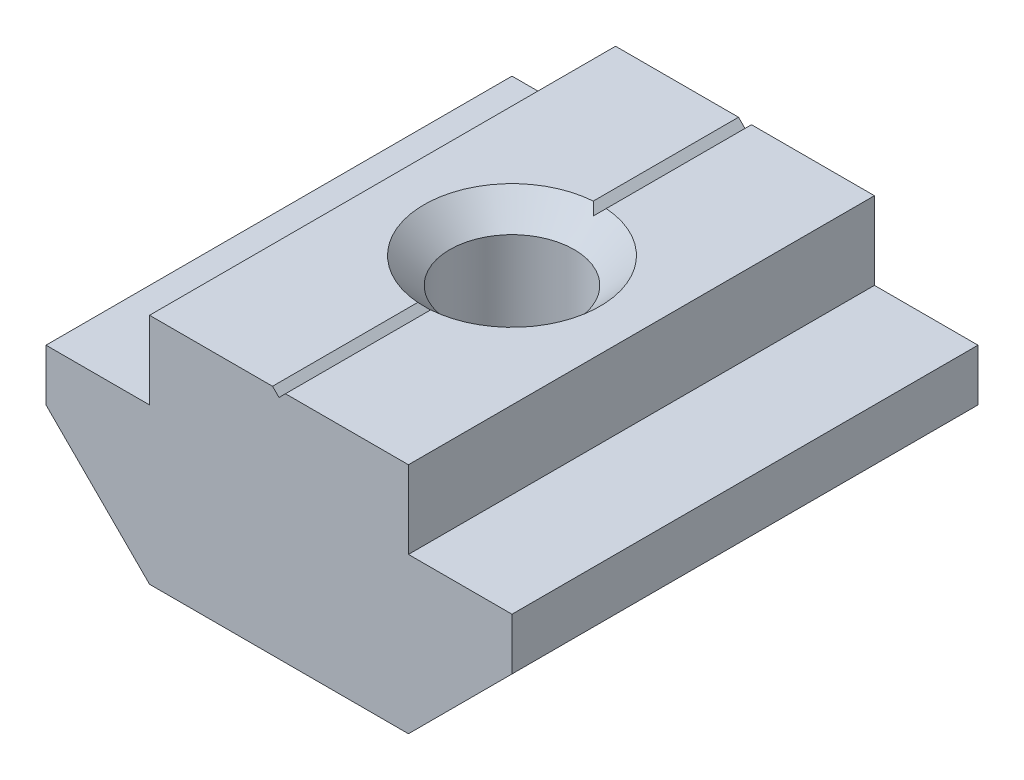
ISO-10303-21;
HEADER;
FILE_DESCRIPTION(('STEP AP214'),'2;1');
FILE_NAME('part.step','',(''),(''),'','','');
FILE_SCHEMA(('AUTOMOTIVE_DESIGN { 1 0 10303 214 1 1 1 1 }'));
ENDSEC;
DATA;
#1=APPLICATION_CONTEXT('core data for automotive mechanical design processes');
#2=APPLICATION_PROTOCOL_DEFINITION('international standard','automotive_design',2000,#1);
#3=PRODUCT_CONTEXT('',#1,'mechanical');
#4=PRODUCT('Part','Part','',(#3));
#5=PRODUCT_RELATED_PRODUCT_CATEGORY('part','',(#4));
#6=PRODUCT_DEFINITION_FORMATION('','',#4);
#7=PRODUCT_DEFINITION_CONTEXT('part definition',#1,'design');
#8=PRODUCT_DEFINITION('design','',#6,#7);
#9=PRODUCT_DEFINITION_SHAPE('','',#8);
#10=(LENGTH_UNIT() NAMED_UNIT(*) SI_UNIT(.MILLI.,.METRE.));
#11=(NAMED_UNIT(*) PLANE_ANGLE_UNIT() SI_UNIT($,.RADIAN.));
#12=(NAMED_UNIT(*) SI_UNIT($,.STERADIAN.) SOLID_ANGLE_UNIT());
#13=UNCERTAINTY_MEASURE_WITH_UNIT(LENGTH_MEASURE(1.E-05),#10,'distance_accuracy_value','');
#14=(GEOMETRIC_REPRESENTATION_CONTEXT(3) GLOBAL_UNCERTAINTY_ASSIGNED_CONTEXT((#13)) GLOBAL_UNIT_ASSIGNED_CONTEXT((#10,
#11,#12)) REPRESENTATION_CONTEXT('',''));
#15=CARTESIAN_POINT('',(0.,0.,0.));
#16=DIRECTION('',(0.,0.,1.));
#17=DIRECTION('',(1.,0.,0.));
#18=AXIS2_PLACEMENT_3D('',#15,#16,#17);
#19=CARTESIAN_POINT('',(0.25,9.,18.));
#20=DIRECTION('',(0.707106781186543,-0.707106781186552,0.));
#21=DIRECTION('',(0.707106781186552,0.707106781186543,0.));
#22=AXIS2_PLACEMENT_3D('',#19,#20,#21);
#23=PLANE('',#22);
#24=DIRECTION('',(0.,0.,-1.));
#25=VECTOR('',#24,1.);
#26=CARTESIAN_POINT('',(0.25,9.,18.));
#27=LINE('',#26,#25);
#28=CARTESIAN_POINT('',(0.25,9.,18.));
#29=VERTEX_POINT('',#28);
#30=CARTESIAN_POINT('',(0.250000000000002,9.,12.3907963666372));
#31=VERTEX_POINT('',#30);
#32=EDGE_CURVE('E259',#29,#31,#27,.T.);
#33=ORIENTED_EDGE('',*,*,#32,.T.);
#34=CARTESIAN_POINT('',(0.2502,9.0002,12.3909821586083));
#35=CARTESIAN_POINT('',(0.207979234163481,8.95797923416348,12.3517976118688));
#36=CARTESIAN_POINT('',(0.166002242608615,8.91600224260861,12.3121068827314));
#37=CARTESIAN_POINT('',(0.0825355731981371,8.83253557319814,12.2317128334428));
#38=CARTESIAN_POINT('',(0.0410458980863347,8.79104589808634,12.1910095075942));
#39=CARTESIAN_POINT('',(-0.000200000000007266,8.7498,12.1497999936504));
#40=B_SPLINE_CURVE_WITH_KNOTS('',3,(#34,#35,#36,#37,#38,#39),.UNSPECIFIED.,.F.,.F.,(4,2,4),(0.,
0.21423213245231,0.428465470549166),.UNSPECIFIED.);
#41=CARTESIAN_POINT('',(0.,8.75,12.15));
#42=VERTEX_POINT('',#41);
#43=EDGE_CURVE('E200',#31,#42,#40,.T.);
#44=ORIENTED_EDGE('',*,*,#43,.T.);
#45=DIRECTION('',(0.,0.,-1.));
#46=VECTOR('',#45,1.);
#47=CARTESIAN_POINT('',(0.,8.75,18.));
#48=LINE('',#47,#46);
#49=CARTESIAN_POINT('',(0.,8.75,18.));
#50=VERTEX_POINT('',#49);
#51=EDGE_CURVE('E254',#50,#42,#48,.T.);
#52=ORIENTED_EDGE('',*,*,#51,.F.);
#53=DIRECTION('',(-0.707106781186552,-0.707106781186543,0.));
#54=VECTOR('',#53,1.);
#55=CARTESIAN_POINT('',(0.25,9.,18.));
#56=LINE('',#55,#54);
#57=EDGE_CURVE('E314',#29,#50,#56,.T.);
#58=ORIENTED_EDGE('',*,*,#57,.F.);
#59=EDGE_LOOP('',(#33,#44,#52,#58));
#60=FACE_BOUND('',#59,.T.);
#61=ADVANCED_FACE('F51',(#60),#23,.F.);
#62=CARTESIAN_POINT('',(-0.25,9.,18.));
#63=DIRECTION('',(-0.707106781186543,-0.707106781186552,0.));
#64=DIRECTION('',(0.707106781186552,-0.707106781186543,0.));
#65=AXIS2_PLACEMENT_3D('',#62,#63,#64);
#66=PLANE('',#65);
#67=ORIENTED_EDGE('',*,*,#51,.T.);
#68=CARTESIAN_POINT('',(0.000200000000000102,8.7498,12.1497999936504));
#69=CARTESIAN_POINT('',(-0.041045898086342,8.79104589808634,12.1910095075942));
#70=CARTESIAN_POINT('',(-0.0825355731981417,8.83253557319814,12.2317128334428));
#71=CARTESIAN_POINT('',(-0.166002242608608,8.91600224260861,12.3121068827315));
#72=CARTESIAN_POINT('',(-0.207979234163467,8.95797923416347,12.3517976118689));
#73=CARTESIAN_POINT('',(-0.250199999999975,9.00019999999997,12.3909821586084));
#74=B_SPLINE_CURVE_WITH_KNOTS('',3,(#68,#69,#70,#71,#72,#73),.UNSPECIFIED.,.F.,.F.,(4,2,4),(0.,
0.214233338096856,0.428465470549166),.UNSPECIFIED.);
#75=CARTESIAN_POINT('',(-0.25,9.,12.3907963666372));
#76=VERTEX_POINT('',#75);
#77=EDGE_CURVE('E377',#42,#76,#74,.T.);
#78=ORIENTED_EDGE('',*,*,#77,.T.);
#79=DIRECTION('',(0.,0.,-1.));
#80=VECTOR('',#79,1.);
#81=CARTESIAN_POINT('',(-0.25,9.,18.));
#82=LINE('',#81,#80);
#83=CARTESIAN_POINT('',(-0.25,9.,18.));
#84=VERTEX_POINT('',#83);
#85=EDGE_CURVE('E249',#84,#76,#82,.T.);
#86=ORIENTED_EDGE('',*,*,#85,.F.);
#87=DIRECTION('',(-0.707106781186552,0.707106781186543,0.));
#88=VECTOR('',#87,1.);
#89=CARTESIAN_POINT('',(-0.25,9.,18.));
#90=LINE('',#89,#88);
#91=EDGE_CURVE('E317',#50,#84,#90,.T.);
#92=ORIENTED_EDGE('',*,*,#91,.F.);
#93=EDGE_LOOP('',(#67,#78,#86,#92));
#94=FACE_BOUND('',#93,.T.);
#95=ADVANCED_FACE('F474',(#94),#66,.F.);
#96=CARTESIAN_POINT('',(-4.99999999999996,0.,18.));
#97=DIRECTION('',(0.,1.,0.));
#98=DIRECTION('',(-1.,0.,0.));
#99=AXIS2_PLACEMENT_3D('',#96,#97,#98);
#100=PLANE('',#99);
#101=CARTESIAN_POINT('',(0.,0.,9.));
#102=DIRECTION('',(0.,-1.,0.));
#103=DIRECTION('',(0.,0.,-1.));
#104=AXIS2_PLACEMENT_3D('',#101,#102,#103);
#105=CIRCLE('',#104,3.40000000000001);
#106=CARTESIAN_POINT('',(0.,0.,5.59999999999999));
#107=VERTEX_POINT('',#106);
#108=EDGE_CURVE('E411',#107,#107,#105,.T.);
#109=ORIENTED_EDGE('',*,*,#108,.F.);
#110=EDGE_LOOP('',(#109));
#111=FACE_BOUND('',#110,.T.);
#112=DIRECTION('',(1.,0.,0.));
#113=VECTOR('',#112,1.);
#114=CARTESIAN_POINT('',(-4.99999999999996,0.,0.));
#115=LINE('',#114,#113);
#116=CARTESIAN_POINT('',(-4.99999999999996,0.,0.));
#117=VERTEX_POINT('',#116);
#118=CARTESIAN_POINT('',(4.99999999999996,0.,0.));
#119=VERTEX_POINT('',#118);
#120=EDGE_CURVE('E195',#117,#119,#115,.T.);
#121=ORIENTED_EDGE('',*,*,#120,.T.);
#122=DIRECTION('',(0.,0.,-1.));
#123=VECTOR('',#122,1.);
#124=CARTESIAN_POINT('',(4.99999999999996,0.,18.));
#125=LINE('',#124,#123);
#126=CARTESIAN_POINT('',(4.99999999999996,0.,18.));
#127=VERTEX_POINT('',#126);
#128=EDGE_CURVE('E60',#127,#119,#125,.T.);
#129=ORIENTED_EDGE('',*,*,#128,.F.);
#130=DIRECTION('',(1.,0.,0.));
#131=VECTOR('',#130,1.);
#132=CARTESIAN_POINT('',(-4.99999999999996,0.,18.));
#133=LINE('',#132,#131);
#134=CARTESIAN_POINT('',(-4.99999999999996,0.,18.));
#135=VERTEX_POINT('',#134);
#136=EDGE_CURVE('E237',#135,#127,#133,.T.);
#137=ORIENTED_EDGE('',*,*,#136,.F.);
#138=DIRECTION('',(0.,0.,-1.));
#139=VECTOR('',#138,1.);
#140=CARTESIAN_POINT('',(-4.99999999999996,0.,18.));
#141=LINE('',#140,#139);
#142=EDGE_CURVE('E191',#135,#117,#141,.T.);
#143=ORIENTED_EDGE('',*,*,#142,.T.);
#144=EDGE_LOOP('',(#121,#129,#137,#143));
#145=FACE_BOUND('',#144,.T.);
#146=ADVANCED_FACE('F53',(#111,#145),#100,.F.);
#147=CARTESIAN_POINT('',(4.99999999999996,0.,18.));
#148=DIRECTION('',(-0.707106781186544,0.707106781186551,0.));
#149=DIRECTION('',(-0.707106781186551,-0.707106781186544,0.));
#150=AXIS2_PLACEMENT_3D('',#147,#148,#149);
#151=PLANE('',#150);
#152=DIRECTION('',(0.707106781186551,0.707106781186544,0.));
#153=VECTOR('',#152,1.);
#154=CARTESIAN_POINT('',(4.99999999999996,0.,0.));
#155=LINE('',#154,#153);
#156=CARTESIAN_POINT('',(9.,4.,0.));
#157=VERTEX_POINT('',#156);
#158=EDGE_CURVE('E199',#119,#157,#155,.T.);
#159=ORIENTED_EDGE('',*,*,#158,.T.);
#160=DIRECTION('',(0.,0.,-1.));
#161=VECTOR('',#160,1.);
#162=CARTESIAN_POINT('',(9.,4.,18.));
#163=LINE('',#162,#161);
#164=CARTESIAN_POINT('',(9.,4.,18.));
#165=VERTEX_POINT('',#164);
#166=EDGE_CURVE('E275',#165,#157,#163,.T.);
#167=ORIENTED_EDGE('',*,*,#166,.F.);
#168=DIRECTION('',(0.707106781186551,0.707106781186544,0.));
#169=VECTOR('',#168,1.);
#170=CARTESIAN_POINT('',(4.99999999999996,0.,18.));
#171=LINE('',#170,#169);
#172=EDGE_CURVE('E132',#127,#165,#171,.T.);
#173=ORIENTED_EDGE('',*,*,#172,.F.);
#174=ORIENTED_EDGE('',*,*,#128,.T.);
#175=EDGE_LOOP('',(#159,#167,#173,#174));
#176=FACE_BOUND('',#175,.T.);
#177=ADVANCED_FACE('F281',(#176),#151,.F.);
#178=CARTESIAN_POINT('',(9.,4.,18.));
#179=DIRECTION('',(-1.,0.,0.));
#180=DIRECTION('',(0.,0.,1.));
#181=AXIS2_PLACEMENT_3D('',#178,#179,#180);
#182=PLANE('',#181);
#183=DIRECTION('',(0.,1.,0.));
#184=VECTOR('',#183,1.);
#185=CARTESIAN_POINT('',(9.,4.,0.));
#186=LINE('',#185,#184);
#187=CARTESIAN_POINT('',(9.,6.,0.));
#188=VERTEX_POINT('',#187);
#189=EDGE_CURVE('E203',#157,#188,#186,.T.);
#190=ORIENTED_EDGE('',*,*,#189,.T.);
#191=DIRECTION('',(0.,0.,-1.));
#192=VECTOR('',#191,1.);
#193=CARTESIAN_POINT('',(9.,6.,18.));
#194=LINE('',#193,#192);
#195=CARTESIAN_POINT('',(9.,6.,18.));
#196=VERTEX_POINT('',#195);
#197=EDGE_CURVE('E271',#196,#188,#194,.T.);
#198=ORIENTED_EDGE('',*,*,#197,.F.);
#199=DIRECTION('',(0.,1.,0.));
#200=VECTOR('',#199,1.);
#201=CARTESIAN_POINT('',(9.,4.,18.));
#202=LINE('',#201,#200);
#203=EDGE_CURVE('E302',#165,#196,#202,.T.);
#204=ORIENTED_EDGE('',*,*,#203,.F.);
#205=ORIENTED_EDGE('',*,*,#166,.T.);
#206=EDGE_LOOP('',(#190,#198,#204,#205));
#207=FACE_BOUND('',#206,.T.);
#208=ADVANCED_FACE('F292',(#207),#182,.F.);
#209=CARTESIAN_POINT('',(9.,6.,18.));
#210=DIRECTION('',(0.,-1.,0.));
#211=DIRECTION('',(0.,0.,-1.));
#212=AXIS2_PLACEMENT_3D('',#209,#210,#211);
#213=PLANE('',#212);
#214=DIRECTION('',(-1.,0.,0.));
#215=VECTOR('',#214,1.);
#216=CARTESIAN_POINT('',(9.,6.,0.));
#217=LINE('',#216,#215);
#218=CARTESIAN_POINT('',(5.,6.,0.));
#219=VERTEX_POINT('',#218);
#220=EDGE_CURVE('E206',#188,#219,#217,.T.);
#221=ORIENTED_EDGE('',*,*,#220,.T.);
#222=DIRECTION('',(0.,0.,-1.));
#223=VECTOR('',#222,1.);
#224=CARTESIAN_POINT('',(5.,6.,18.));
#225=LINE('',#224,#223);
#226=CARTESIAN_POINT('',(5.,6.,18.));
#227=VERTEX_POINT('',#226);
#228=EDGE_CURVE('E267',#227,#219,#225,.T.);
#229=ORIENTED_EDGE('',*,*,#228,.F.);
#230=DIRECTION('',(-1.,0.,0.));
#231=VECTOR('',#230,1.);
#232=CARTESIAN_POINT('',(9.,6.,18.));
#233=LINE('',#232,#231);
#234=EDGE_CURVE('E298',#196,#227,#233,.T.);
#235=ORIENTED_EDGE('',*,*,#234,.F.);
#236=ORIENTED_EDGE('',*,*,#197,.T.);
#237=EDGE_LOOP('',(#221,#229,#235,#236));
#238=FACE_BOUND('',#237,.T.);
#239=ADVANCED_FACE('F296',(#238),#213,.F.);
#240=CARTESIAN_POINT('',(5.,6.,18.));
#241=DIRECTION('',(-1.,0.,0.));
#242=DIRECTION('',(0.,0.,1.));
#243=AXIS2_PLACEMENT_3D('',#240,#241,#242);
#244=PLANE('',#243);
#245=DIRECTION('',(0.,1.,0.));
#246=VECTOR('',#245,1.);
#247=CARTESIAN_POINT('',(5.,6.,0.));
#248=LINE('',#247,#246);
#249=CARTESIAN_POINT('',(5.,9.,0.));
#250=VERTEX_POINT('',#249);
#251=EDGE_CURVE('E209',#219,#250,#248,.T.);
#252=ORIENTED_EDGE('',*,*,#251,.T.);
#253=DIRECTION('',(0.,0.,-1.));
#254=VECTOR('',#253,1.);
#255=CARTESIAN_POINT('',(5.,9.,18.));
#256=LINE('',#255,#254);
#257=CARTESIAN_POINT('',(5.,9.,18.));
#258=VERTEX_POINT('',#257);
#259=EDGE_CURVE('E263',#258,#250,#256,.T.);
#260=ORIENTED_EDGE('',*,*,#259,.F.);
#261=DIRECTION('',(0.,1.,0.));
#262=VECTOR('',#261,1.);
#263=CARTESIAN_POINT('',(5.,6.,18.));
#264=LINE('',#263,#262);
#265=EDGE_CURVE('E301',#227,#258,#264,.T.);
#266=ORIENTED_EDGE('',*,*,#265,.F.);
#267=ORIENTED_EDGE('',*,*,#228,.T.);
#268=EDGE_LOOP('',(#252,#260,#266,#267));
#269=FACE_BOUND('',#268,.T.);
#270=ADVANCED_FACE('F462',(#269),#244,.F.);
#271=CARTESIAN_POINT('',(5.,9.,18.));
#272=DIRECTION('',(0.,-1.,0.));
#273=DIRECTION('',(0.,0.,-1.));
#274=AXIS2_PLACEMENT_3D('',#271,#272,#273);
#275=PLANE('',#274);
#276=CARTESIAN_POINT('',(0.250000000000001,9.,5.6092036333628));
#277=VERTEX_POINT('',#276);
#278=CARTESIAN_POINT('',(0.25,9.,0.));
#279=VERTEX_POINT('',#278);
#280=EDGE_CURVE('E258',#277,#279,#27,.T.);
#281=ORIENTED_EDGE('',*,*,#280,.F.);
#282=CARTESIAN_POINT('',(0.,9.,9.));
#283=DIRECTION('',(0.,-1.,0.));
#284=DIRECTION('',(0.,0.,-1.));
#285=AXIS2_PLACEMENT_3D('',#282,#283,#284);
#286=CIRCLE('',#285,3.4);
#287=EDGE_CURVE('E393',#277,#31,#286,.T.);
#288=ORIENTED_EDGE('',*,*,#287,.T.);
#289=ORIENTED_EDGE('',*,*,#32,.F.);
#290=DIRECTION('',(-1.,0.,0.));
#291=VECTOR('',#290,1.);
#292=CARTESIAN_POINT('',(5.,9.,18.));
#293=LINE('',#292,#291);
#294=EDGE_CURVE('E307',#258,#29,#293,.T.);
#295=ORIENTED_EDGE('',*,*,#294,.F.);
#296=ORIENTED_EDGE('',*,*,#259,.T.);
#297=DIRECTION('',(-1.,0.,0.));
#298=VECTOR('',#297,1.);
#299=CARTESIAN_POINT('',(5.,9.,0.));
#300=LINE('',#299,#298);
#301=EDGE_CURVE('E212',#250,#279,#300,.T.);
#302=ORIENTED_EDGE('',*,*,#301,.T.);
#303=EDGE_LOOP('',(#281,#288,#289,#295,#296,#302));
#304=FACE_BOUND('',#303,.T.);
#305=ADVANCED_FACE('F457',(#304),#275,.F.);
#306=CARTESIAN_POINT('',(0.,8.75,5.84999999999999));
#307=VERTEX_POINT('',#306);
#308=CARTESIAN_POINT('',(0.,8.75,0.));
#309=VERTEX_POINT('',#308);
#310=EDGE_CURVE('E253',#307,#309,#48,.T.);
#311=ORIENTED_EDGE('',*,*,#310,.F.);
#312=CARTESIAN_POINT('',(-0.000200000000000256,8.7498,5.8502000063496));
#313=CARTESIAN_POINT('',(0.0410458980863417,8.79104589808634,5.80899049240578));
#314=CARTESIAN_POINT('',(0.0825355731981412,8.83253557319814,5.76828716655719));
#315=CARTESIAN_POINT('',(0.166002242608608,8.91600224260861,5.68789311726854));
#316=CARTESIAN_POINT('',(0.207979234163467,8.95797923416347,5.64820238813115));
#317=CARTESIAN_POINT('',(0.250199999999975,9.00019999999997,5.60901784139162));
#318=B_SPLINE_CURVE_WITH_KNOTS('',3,(#312,#313,#314,#315,#316,#317),.UNSPECIFIED.,.F.,.F.,(4,2,
4),(0.,0.214233338096855,0.428465470549165),.UNSPECIFIED.);
#319=EDGE_CURVE('E383',#307,#277,#318,.T.);
#320=ORIENTED_EDGE('',*,*,#319,.T.);
#321=ORIENTED_EDGE('',*,*,#280,.T.);
#322=DIRECTION('',(-0.707106781186552,-0.707106781186543,0.));
#323=VECTOR('',#322,1.);
#324=CARTESIAN_POINT('',(0.25,9.,0.));
#325=LINE('',#324,#323);
#326=EDGE_CURVE('E216',#279,#309,#325,.T.);
#327=ORIENTED_EDGE('',*,*,#326,.T.);
#328=EDGE_LOOP('',(#311,#320,#321,#327));
#329=FACE_BOUND('',#328,.T.);
#330=ADVANCED_FACE('F453',(#329),#23,.F.);
#331=CARTESIAN_POINT('',(-0.25,9.,5.60920363336281));
#332=VERTEX_POINT('',#331);
#333=CARTESIAN_POINT('',(-0.25,9.,0.));
#334=VERTEX_POINT('',#333);
#335=EDGE_CURVE('E248',#332,#334,#82,.T.);
#336=ORIENTED_EDGE('',*,*,#335,.F.);
#337=CARTESIAN_POINT('',(-0.2502,9.0002,5.60901784139167));
#338=CARTESIAN_POINT('',(-0.207979234163481,8.95797923416348,5.64820238813117));
#339=CARTESIAN_POINT('',(-0.166002242608615,8.91600224260861,5.68789311726855));
#340=CARTESIAN_POINT('',(-0.082535573198137,8.83253557319814,5.76828716655718));
#341=CARTESIAN_POINT('',(-0.0410458980863346,8.79104589808634,5.80899049240577));
#342=CARTESIAN_POINT('',(0.000200000000007443,8.7498,5.85020000634959));
#343=B_SPLINE_CURVE_WITH_KNOTS('',3,(#337,#338,#339,#340,#341,#342),.UNSPECIFIED.,.F.,.F.,(4,2,
4),(0.,0.21423213245231,0.428465470549166),.UNSPECIFIED.);
#344=EDGE_CURVE('E67',#332,#307,#343,.T.);
#345=ORIENTED_EDGE('',*,*,#344,.T.);
#346=ORIENTED_EDGE('',*,*,#310,.T.);
#347=DIRECTION('',(-0.707106781186552,0.707106781186543,0.));
#348=VECTOR('',#347,1.);
#349=CARTESIAN_POINT('',(-0.25,9.,0.));
#350=LINE('',#349,#348);
#351=EDGE_CURVE('E220',#309,#334,#350,.T.);
#352=ORIENTED_EDGE('',*,*,#351,.T.);
#353=EDGE_LOOP('',(#336,#345,#346,#352));
#354=FACE_BOUND('',#353,.T.);
#355=ADVANCED_FACE('F430',(#354),#66,.F.);
#356=CARTESIAN_POINT('',(-5.,9.,18.));
#357=DIRECTION('',(0.,-1.,0.));
#358=DIRECTION('',(0.,0.,-1.));
#359=AXIS2_PLACEMENT_3D('',#356,#357,#358);
#360=PLANE('',#359);
#361=ORIENTED_EDGE('',*,*,#85,.T.);
#362=CARTESIAN_POINT('',(0.,9.,9.));
#363=DIRECTION('',(0.,-1.,0.));
#364=DIRECTION('',(0.,0.,-1.));
#365=AXIS2_PLACEMENT_3D('',#362,#363,#364);
#366=CIRCLE('',#365,3.4);
#367=EDGE_CURVE('E11',#76,#332,#366,.T.);
#368=ORIENTED_EDGE('',*,*,#367,.T.);
#369=ORIENTED_EDGE('',*,*,#335,.T.);
#370=DIRECTION('',(-1.,0.,0.));
#371=VECTOR('',#370,1.);
#372=CARTESIAN_POINT('',(-5.,9.,0.));
#373=LINE('',#372,#371);
#374=CARTESIAN_POINT('',(-5.,9.,0.));
#375=VERTEX_POINT('',#374);
#376=EDGE_CURVE('E224',#334,#375,#373,.T.);
#377=ORIENTED_EDGE('',*,*,#376,.T.);
#378=DIRECTION('',(0.,0.,-1.));
#379=VECTOR('',#378,1.);
#380=CARTESIAN_POINT('',(-5.,9.,18.));
#381=LINE('',#380,#379);
#382=CARTESIAN_POINT('',(-5.,9.,18.));
#383=VERTEX_POINT('',#382);
#384=EDGE_CURVE('E244',#383,#375,#381,.T.);
#385=ORIENTED_EDGE('',*,*,#384,.F.);
#386=DIRECTION('',(-1.,0.,0.));
#387=VECTOR('',#386,1.);
#388=CARTESIAN_POINT('',(-5.,9.,18.));
#389=LINE('',#388,#387);
#390=EDGE_CURVE('E320',#84,#383,#389,.T.);
#391=ORIENTED_EDGE('',*,*,#390,.F.);
#392=EDGE_LOOP('',(#361,#368,#369,#377,#385,#391));
#393=FACE_BOUND('',#392,.T.);
#394=ADVANCED_FACE('F526',(#393),#360,.F.);
#395=CARTESIAN_POINT('',(-5.,6.,18.));
#396=DIRECTION('',(1.,0.,0.));
#397=DIRECTION('',(0.,0.,-1.));
#398=AXIS2_PLACEMENT_3D('',#395,#396,#397);
#399=PLANE('',#398);
#400=DIRECTION('',(0.,-1.,0.));
#401=VECTOR('',#400,1.);
#402=CARTESIAN_POINT('',(-5.,6.,0.));
#403=LINE('',#402,#401);
#404=CARTESIAN_POINT('',(-5.,6.,0.));
#405=VERTEX_POINT('',#404);
#406=EDGE_CURVE('E227',#375,#405,#403,.T.);
#407=ORIENTED_EDGE('',*,*,#406,.T.);
#408=DIRECTION('',(0.,0.,-1.));
#409=VECTOR('',#408,1.);
#410=CARTESIAN_POINT('',(-5.,6.,18.));
#411=LINE('',#410,#409);
#412=CARTESIAN_POINT('',(-5.,6.,18.));
#413=VERTEX_POINT('',#412);
#414=EDGE_CURVE('E183',#413,#405,#411,.T.);
#415=ORIENTED_EDGE('',*,*,#414,.F.);
#416=DIRECTION('',(0.,-1.,0.));
#417=VECTOR('',#416,1.);
#418=CARTESIAN_POINT('',(-5.,6.,18.));
#419=LINE('',#418,#417);
#420=EDGE_CURVE('E169',#383,#413,#419,.T.);
#421=ORIENTED_EDGE('',*,*,#420,.F.);
#422=ORIENTED_EDGE('',*,*,#384,.T.);
#423=EDGE_LOOP('',(#407,#415,#421,#422));
#424=FACE_BOUND('',#423,.T.);
#425=ADVANCED_FACE('F531',(#424),#399,.F.);
#426=CARTESIAN_POINT('',(-9.,6.,18.));
#427=DIRECTION('',(0.,-1.,0.));
#428=DIRECTION('',(0.,0.,-1.));
#429=AXIS2_PLACEMENT_3D('',#426,#427,#428);
#430=PLANE('',#429);
#431=DIRECTION('',(-1.,0.,0.));
#432=VECTOR('',#431,1.);
#433=CARTESIAN_POINT('',(-9.,6.,0.));
#434=LINE('',#433,#432);
#435=CARTESIAN_POINT('',(-9.,6.,0.));
#436=VERTEX_POINT('',#435);
#437=EDGE_CURVE('E179',#405,#436,#434,.T.);
#438=ORIENTED_EDGE('',*,*,#437,.T.);
#439=DIRECTION('',(0.,0.,-1.));
#440=VECTOR('',#439,1.);
#441=CARTESIAN_POINT('',(-9.,6.,18.));
#442=LINE('',#441,#440);
#443=CARTESIAN_POINT('',(-9.,6.,18.));
#444=VERTEX_POINT('',#443);
#445=EDGE_CURVE('E176',#444,#436,#442,.T.);
#446=ORIENTED_EDGE('',*,*,#445,.F.);
#447=DIRECTION('',(-1.,0.,0.));
#448=VECTOR('',#447,1.);
#449=CARTESIAN_POINT('',(-9.,6.,18.));
#450=LINE('',#449,#448);
#451=EDGE_CURVE('E162',#413,#444,#450,.T.);
#452=ORIENTED_EDGE('',*,*,#451,.F.);
#453=ORIENTED_EDGE('',*,*,#414,.T.);
#454=EDGE_LOOP('',(#438,#446,#452,#453));
#455=FACE_BOUND('',#454,.T.);
#456=ADVANCED_FACE('F177',(#455),#430,.F.);
#457=CARTESIAN_POINT('',(-9.,4.,18.));
#458=DIRECTION('',(1.,0.,0.));
#459=DIRECTION('',(0.,0.,-1.));
#460=AXIS2_PLACEMENT_3D('',#457,#458,#459);
#461=PLANE('',#460);
#462=DIRECTION('',(0.,-1.,0.));
#463=VECTOR('',#462,1.);
#464=CARTESIAN_POINT('',(-9.,4.,0.));
#465=LINE('',#464,#463);
#466=CARTESIAN_POINT('',(-9.,4.,0.));
#467=VERTEX_POINT('',#466);
#468=EDGE_CURVE('E232',#436,#467,#465,.T.);
#469=ORIENTED_EDGE('',*,*,#468,.T.);
#470=DIRECTION('',(0.,0.,-1.));
#471=VECTOR('',#470,1.);
#472=CARTESIAN_POINT('',(-9.,4.,18.));
#473=LINE('',#472,#471);
#474=CARTESIAN_POINT('',(-9.,4.,18.));
#475=VERTEX_POINT('',#474);
#476=EDGE_CURVE('E184',#475,#467,#473,.T.);
#477=ORIENTED_EDGE('',*,*,#476,.F.);
#478=DIRECTION('',(0.,-1.,0.));
#479=VECTOR('',#478,1.);
#480=CARTESIAN_POINT('',(-9.,4.,18.));
#481=LINE('',#480,#479);
#482=EDGE_CURVE('E166',#444,#475,#481,.T.);
#483=ORIENTED_EDGE('',*,*,#482,.F.);
#484=ORIENTED_EDGE('',*,*,#445,.T.);
#485=EDGE_LOOP('',(#469,#477,#483,#484));
#486=FACE_BOUND('',#485,.T.);
#487=ADVANCED_FACE('F186',(#486),#461,.F.);
#488=CARTESIAN_POINT('',(-4.99999999999996,0.,18.));
#489=DIRECTION('',(0.707106781186544,0.707106781186551,0.));
#490=DIRECTION('',(-0.707106781186551,0.707106781186544,0.));
#491=AXIS2_PLACEMENT_3D('',#488,#489,#490);
#492=PLANE('',#491);
#493=DIRECTION('',(0.707106781186551,-0.707106781186544,0.));
#494=VECTOR('',#493,1.);
#495=CARTESIAN_POINT('',(-4.99999999999996,0.,0.));
#496=LINE('',#495,#494);
#497=EDGE_CURVE('E123',#467,#117,#496,.T.);
#498=ORIENTED_EDGE('',*,*,#497,.T.);
#499=ORIENTED_EDGE('',*,*,#142,.F.);
#500=DIRECTION('',(0.707106781186551,-0.707106781186544,0.));
#501=VECTOR('',#500,1.);
#502=CARTESIAN_POINT('',(-4.99999999999996,0.,18.));
#503=LINE('',#502,#501);
#504=EDGE_CURVE('E75',#475,#135,#503,.T.);
#505=ORIENTED_EDGE('',*,*,#504,.F.);
#506=ORIENTED_EDGE('',*,*,#476,.T.);
#507=EDGE_LOOP('',(#498,#499,#505,#506));
#508=FACE_BOUND('',#507,.T.);
#509=ADVANCED_FACE('F548',(#508),#492,.F.);
#510=CARTESIAN_POINT('',(0.,0.,18.));
#511=DIRECTION('',(0.,0.,1.));
#512=DIRECTION('',(1.,0.,0.));
#513=AXIS2_PLACEMENT_3D('',#510,#511,#512);
#514=PLANE('',#513);
#515=ORIENTED_EDGE('',*,*,#136,.T.);
#516=ORIENTED_EDGE('',*,*,#172,.T.);
#517=ORIENTED_EDGE('',*,*,#203,.T.);
#518=ORIENTED_EDGE('',*,*,#234,.T.);
#519=ORIENTED_EDGE('',*,*,#265,.T.);
#520=ORIENTED_EDGE('',*,*,#294,.T.);
#521=ORIENTED_EDGE('',*,*,#57,.T.);
#522=ORIENTED_EDGE('',*,*,#91,.T.);
#523=ORIENTED_EDGE('',*,*,#390,.T.);
#524=ORIENTED_EDGE('',*,*,#420,.T.);
#525=ORIENTED_EDGE('',*,*,#451,.T.);
#526=ORIENTED_EDGE('',*,*,#482,.T.);
#527=ORIENTED_EDGE('',*,*,#504,.T.);
#528=EDGE_LOOP('',(#515,#516,#517,#518,#519,#520,#521,#522,#523,#524,#525,#526,#527));
#529=FACE_BOUND('',#528,.T.);
#530=ADVANCED_FACE('F164',(#529),#514,.T.);
#531=CARTESIAN_POINT('',(0.,0.,0.));
#532=DIRECTION('',(0.,0.,1.));
#533=DIRECTION('',(1.,0.,0.));
#534=AXIS2_PLACEMENT_3D('',#531,#532,#533);
#535=PLANE('',#534);
#536=ORIENTED_EDGE('',*,*,#120,.F.);
#537=ORIENTED_EDGE('',*,*,#497,.F.);
#538=ORIENTED_EDGE('',*,*,#468,.F.);
#539=ORIENTED_EDGE('',*,*,#437,.F.);
#540=ORIENTED_EDGE('',*,*,#406,.F.);
#541=ORIENTED_EDGE('',*,*,#376,.F.);
#542=ORIENTED_EDGE('',*,*,#351,.F.);
#543=ORIENTED_EDGE('',*,*,#326,.F.);
#544=ORIENTED_EDGE('',*,*,#301,.F.);
#545=ORIENTED_EDGE('',*,*,#251,.F.);
#546=ORIENTED_EDGE('',*,*,#220,.F.);
#547=ORIENTED_EDGE('',*,*,#189,.F.);
#548=ORIENTED_EDGE('',*,*,#158,.F.);
#549=EDGE_LOOP('',(#536,#537,#538,#539,#540,#541,#542,#543,#544,#545,#546,#547,#548));
#550=FACE_BOUND('',#549,.T.);
#551=ADVANCED_FACE('F286',(#550),#535,.F.);
#552=CARTESIAN_POINT('',(0.,7.99999999999999,9.));
#553=DIRECTION('',(0.,1.,0.));
#554=DIRECTION('',(0.,0.,1.));
#555=AXIS2_PLACEMENT_3D('',#552,#553,#554);
#556=CONICAL_SURFACE('',#555,2.4,0.785398163397443);
#557=CARTESIAN_POINT('',(0.,7.99999999999999,9.));
#558=DIRECTION('',(0.,-1.,0.));
#559=DIRECTION('',(0.,0.,-1.));
#560=AXIS2_PLACEMENT_3D('',#557,#558,#559);
#561=CIRCLE('',#560,2.4);
#562=CARTESIAN_POINT('',(0.,7.99999999999999,6.6));
#563=VERTEX_POINT('',#562);
#564=EDGE_CURVE('E399',#563,#563,#561,.T.);
#565=ORIENTED_EDGE('',*,*,#564,.T.);
#566=EDGE_LOOP('',(#565));
#567=FACE_BOUND('',#566,.T.);
#568=ORIENTED_EDGE('',*,*,#287,.F.);
#569=ORIENTED_EDGE('',*,*,#319,.F.);
#570=ORIENTED_EDGE('',*,*,#344,.F.);
#571=ORIENTED_EDGE('',*,*,#367,.F.);
#572=ORIENTED_EDGE('',*,*,#77,.F.);
#573=ORIENTED_EDGE('',*,*,#43,.F.);
#574=EDGE_LOOP('',(#568,#569,#570,#571,#572,#573));
#575=FACE_BOUND('',#574,.T.);
#576=ADVANCED_FACE('F433',(#567,#575),#556,.F.);
#577=CARTESIAN_POINT('',(0.,0.,9.));
#578=DIRECTION('',(0.,-1.,0.));
#579=DIRECTION('',(0.,0.,-1.));
#580=AXIS2_PLACEMENT_3D('',#577,#578,#579);
#581=CYLINDRICAL_SURFACE('',#580,2.4);
#582=ORIENTED_EDGE('',*,*,#564,.F.);
#583=EDGE_LOOP('',(#582));
#584=FACE_BOUND('',#583,.T.);
#585=CARTESIAN_POINT('',(0.,1.,9.));
#586=DIRECTION('',(0.,-1.,0.));
#587=DIRECTION('',(0.,0.,-1.));
#588=AXIS2_PLACEMENT_3D('',#585,#586,#587);
#589=CIRCLE('',#588,2.4);
#590=CARTESIAN_POINT('',(0.,1.,6.6));
#591=VERTEX_POINT('',#590);
#592=EDGE_CURVE('E405',#591,#591,#589,.T.);
#593=ORIENTED_EDGE('',*,*,#592,.T.);
#594=EDGE_LOOP('',(#593));
#595=FACE_BOUND('',#594,.T.);
#596=ADVANCED_FACE('F438',(#584,#595),#581,.F.);
#597=CARTESIAN_POINT('',(0.,0.,9.));
#598=DIRECTION('',(0.,-1.,0.));
#599=DIRECTION('',(0.,0.,-1.));
#600=AXIS2_PLACEMENT_3D('',#597,#598,#599);
#601=CONICAL_SURFACE('',#600,3.40000000000001,0.785398163397454);
#602=ORIENTED_EDGE('',*,*,#592,.F.);
#603=EDGE_LOOP('',(#602));
#604=FACE_BOUND('',#603,.T.);
#605=ORIENTED_EDGE('',*,*,#108,.T.);
#606=EDGE_LOOP('',(#605));
#607=FACE_BOUND('',#606,.T.);
#608=ADVANCED_FACE('F646',(#604,#607),#601,.F.);
#609=CLOSED_SHELL('',(#61,#95,#146,#177,#208,#239,#270,#305,#330,#355,#394,#425,#456,#487,#509,
#530,#551,#576,#596,#608));
#610=MANIFOLD_SOLID_BREP('B2',#609);
#611=ADVANCED_BREP_SHAPE_REPRESENTATION('',(#18,#610),#14);
#612=SHAPE_DEFINITION_REPRESENTATION(#9,#611);
ENDSEC;
END-ISO-10303-21;
